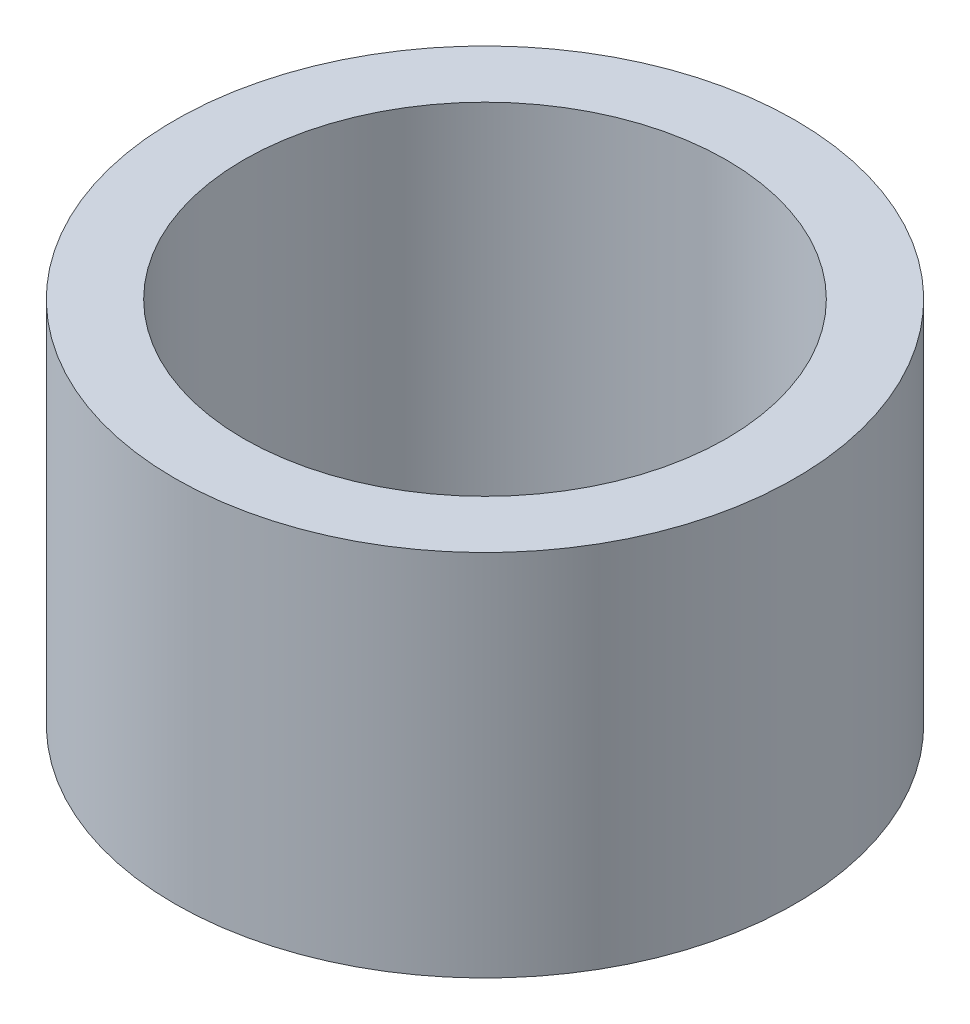
ISO-10303-21;
HEADER;
FILE_DESCRIPTION(('STEP AP214'),'2;1');
FILE_NAME('part.step','',(''),(''),'','','');
FILE_SCHEMA(('AUTOMOTIVE_DESIGN { 1 0 10303 214 1 1 1 1 }'));
ENDSEC;
DATA;
#1=APPLICATION_CONTEXT('core data for automotive mechanical design processes');
#2=APPLICATION_PROTOCOL_DEFINITION('international standard','automotive_design',2000,#1);
#3=PRODUCT_CONTEXT('',#1,'mechanical');
#4=PRODUCT('Part','Part','',(#3));
#5=PRODUCT_RELATED_PRODUCT_CATEGORY('part','',(#4));
#6=PRODUCT_DEFINITION_FORMATION('','',#4);
#7=PRODUCT_DEFINITION_CONTEXT('part definition',#1,'design');
#8=PRODUCT_DEFINITION('design','',#6,#7);
#9=PRODUCT_DEFINITION_SHAPE('','',#8);
#10=(LENGTH_UNIT() NAMED_UNIT(*) SI_UNIT(.MILLI.,.METRE.));
#11=(NAMED_UNIT(*) PLANE_ANGLE_UNIT() SI_UNIT($,.RADIAN.));
#12=(NAMED_UNIT(*) SI_UNIT($,.STERADIAN.) SOLID_ANGLE_UNIT());
#13=UNCERTAINTY_MEASURE_WITH_UNIT(LENGTH_MEASURE(1.E-05),#10,'distance_accuracy_value','');
#14=(GEOMETRIC_REPRESENTATION_CONTEXT(3) GLOBAL_UNCERTAINTY_ASSIGNED_CONTEXT((#13)) GLOBAL_UNIT_ASSIGNED_CONTEXT((#10,
#11,#12)) REPRESENTATION_CONTEXT('',''));
#15=CARTESIAN_POINT('',(0.,0.,0.));
#16=DIRECTION('',(0.,0.,1.));
#17=DIRECTION('',(1.,0.,0.));
#18=AXIS2_PLACEMENT_3D('',#15,#16,#17);
#19=CARTESIAN_POINT('',(0.,6.411459999,0.));
#20=DIRECTION('',(0.,1.,0.));
#21=DIRECTION('',(0.,0.,1.));
#22=AXIS2_PLACEMENT_3D('',#19,#20,#21);
#23=PLANE('',#22);
#24=CARTESIAN_POINT('',(0.,6.411459999,0.));
#25=DIRECTION('',(0.,1.,0.));
#26=DIRECTION('',(0.,0.,1.));
#27=AXIS2_PLACEMENT_3D('',#24,#25,#26);
#28=CIRCLE('',#27,5.3975);
#29=CARTESIAN_POINT('',(0.,6.411459999,5.3975));
#30=VERTEX_POINT('',#29);
#31=EDGE_CURVE('E10',#30,#30,#28,.T.);
#32=ORIENTED_EDGE('',*,*,#31,.T.);
#33=EDGE_LOOP('',(#32));
#34=FACE_BOUND('',#33,.T.);
#35=CARTESIAN_POINT('',(0.,6.411459999,0.));
#36=DIRECTION('',(0.,1.,0.));
#37=DIRECTION('',(0.,0.,1.));
#38=AXIS2_PLACEMENT_3D('',#35,#36,#37);
#39=CIRCLE('',#38,4.19989);
#40=CARTESIAN_POINT('',(0.,6.411459999,4.19989));
#41=VERTEX_POINT('',#40);
#42=EDGE_CURVE('E56',#41,#41,#39,.T.);
#43=ORIENTED_EDGE('',*,*,#42,.F.);
#44=EDGE_LOOP('',(#43));
#45=FACE_BOUND('',#44,.T.);
#46=ADVANCED_FACE('F43',(#34,#45),#23,.T.);
#47=CARTESIAN_POINT('',(0.,0.,0.));
#48=DIRECTION('',(0.,1.,0.));
#49=DIRECTION('',(0.,0.,1.));
#50=AXIS2_PLACEMENT_3D('',#47,#48,#49);
#51=PLANE('',#50);
#52=CARTESIAN_POINT('',(0.,0.,0.));
#53=DIRECTION('',(0.,1.,0.));
#54=DIRECTION('',(0.,0.,1.));
#55=AXIS2_PLACEMENT_3D('',#52,#53,#54);
#56=CIRCLE('',#55,5.3975);
#57=CARTESIAN_POINT('',(0.,0.,5.3975));
#58=VERTEX_POINT('',#57);
#59=EDGE_CURVE('E47',#58,#58,#56,.T.);
#60=ORIENTED_EDGE('',*,*,#59,.F.);
#61=EDGE_LOOP('',(#60));
#62=FACE_BOUND('',#61,.T.);
#63=CARTESIAN_POINT('',(0.,0.,0.));
#64=DIRECTION('',(0.,1.,0.));
#65=DIRECTION('',(0.,0.,1.));
#66=AXIS2_PLACEMENT_3D('',#63,#64,#65);
#67=CIRCLE('',#66,4.19989);
#68=CARTESIAN_POINT('',(0.,0.,4.19989));
#69=VERTEX_POINT('',#68);
#70=EDGE_CURVE('E58',#69,#69,#67,.T.);
#71=ORIENTED_EDGE('',*,*,#70,.T.);
#72=EDGE_LOOP('',(#71));
#73=FACE_BOUND('',#72,.T.);
#74=ADVANCED_FACE('F70',(#62,#73),#51,.F.);
#75=CARTESIAN_POINT('',(0.,6.411459999,0.));
#76=DIRECTION('',(0.,-1.,0.));
#77=DIRECTION('',(0.,0.,-1.));
#78=AXIS2_PLACEMENT_3D('',#75,#76,#77);
#79=CYLINDRICAL_SURFACE('',#78,5.3975);
#80=ORIENTED_EDGE('',*,*,#31,.F.);
#81=EDGE_LOOP('',(#80));
#82=FACE_BOUND('',#81,.T.);
#83=ORIENTED_EDGE('',*,*,#59,.T.);
#84=EDGE_LOOP('',(#83));
#85=FACE_BOUND('',#84,.T.);
#86=ADVANCED_FACE('F45',(#82,#85),#79,.T.);
#87=CARTESIAN_POINT('',(0.,6.411459999,0.));
#88=DIRECTION('',(0.,-1.,0.));
#89=DIRECTION('',(0.,0.,-1.));
#90=AXIS2_PLACEMENT_3D('',#87,#88,#89);
#91=CYLINDRICAL_SURFACE('',#90,4.19989);
#92=ORIENTED_EDGE('',*,*,#42,.T.);
#93=EDGE_LOOP('',(#92));
#94=FACE_BOUND('',#93,.T.);
#95=ORIENTED_EDGE('',*,*,#70,.F.);
#96=EDGE_LOOP('',(#95));
#97=FACE_BOUND('',#96,.T.);
#98=ADVANCED_FACE('F66',(#94,#97),#91,.F.);
#99=CLOSED_SHELL('',(#46,#74,#86,#98));
#100=MANIFOLD_SOLID_BREP('B2',#99);
#101=ADVANCED_BREP_SHAPE_REPRESENTATION('',(#18,#100),#14);
#102=SHAPE_DEFINITION_REPRESENTATION(#9,#101);
ENDSEC;
END-ISO-10303-21;
